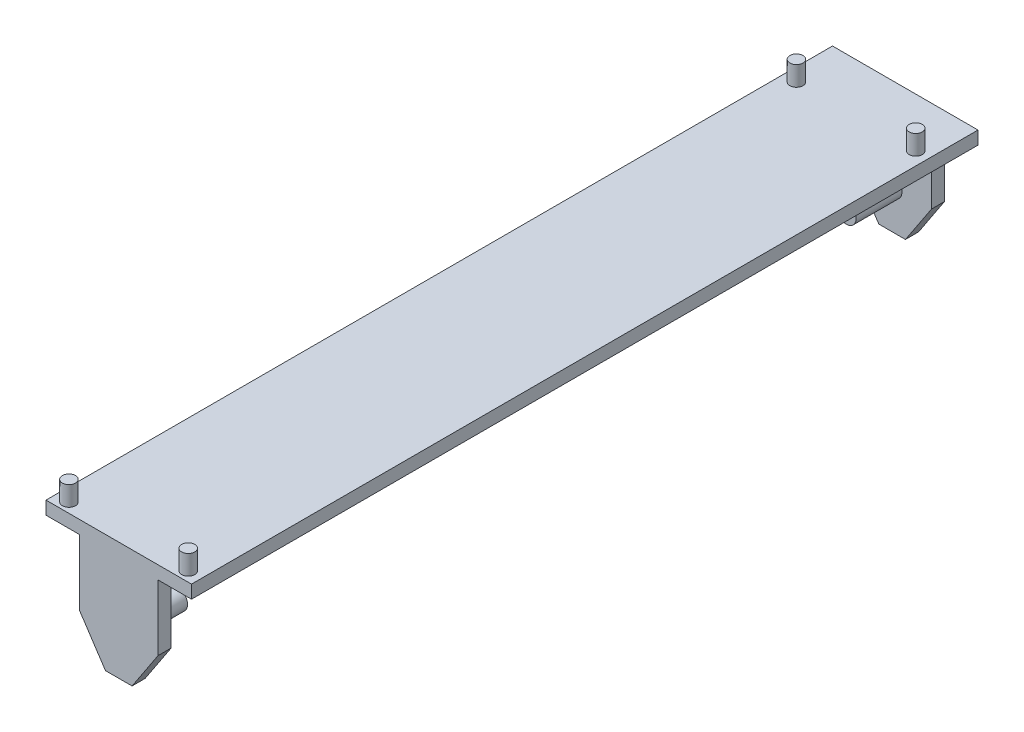
ISO-10303-21;
HEADER;
FILE_DESCRIPTION(('STEP AP214'),'2;1');
FILE_NAME('part.step','',(''),(''),'','','');
FILE_SCHEMA(('AUTOMOTIVE_DESIGN { 1 0 10303 214 1 1 1 1 }'));
ENDSEC;
DATA;
#1=APPLICATION_CONTEXT('core data for automotive mechanical design processes');
#2=APPLICATION_PROTOCOL_DEFINITION('international standard','automotive_design',2000,#1);
#3=PRODUCT_CONTEXT('',#1,'mechanical');
#4=PRODUCT('Part','Part','',(#3));
#5=PRODUCT_RELATED_PRODUCT_CATEGORY('part','',(#4));
#6=PRODUCT_DEFINITION_FORMATION('','',#4);
#7=PRODUCT_DEFINITION_CONTEXT('part definition',#1,'design');
#8=PRODUCT_DEFINITION('design','',#6,#7);
#9=PRODUCT_DEFINITION_SHAPE('','',#8);
#10=(LENGTH_UNIT() NAMED_UNIT(*) SI_UNIT(.MILLI.,.METRE.));
#11=(NAMED_UNIT(*) PLANE_ANGLE_UNIT() SI_UNIT($,.RADIAN.));
#12=(NAMED_UNIT(*) SI_UNIT($,.STERADIAN.) SOLID_ANGLE_UNIT());
#13=UNCERTAINTY_MEASURE_WITH_UNIT(LENGTH_MEASURE(1.E-05),#10,'distance_accuracy_value','');
#14=(GEOMETRIC_REPRESENTATION_CONTEXT(3) GLOBAL_UNCERTAINTY_ASSIGNED_CONTEXT((#13)) GLOBAL_UNIT_ASSIGNED_CONTEXT((#10,
#11,#12)) REPRESENTATION_CONTEXT('',''));
#15=CARTESIAN_POINT('',(0.,0.,0.));
#16=DIRECTION('',(0.,0.,1.));
#17=DIRECTION('',(1.,0.,0.));
#18=AXIS2_PLACEMENT_3D('',#15,#16,#17);
#19=CARTESIAN_POINT('',(-20.8608858903211,-13.8076071996793,10.));
#20=DIRECTION('',(0.833884202399052,0.551939432355849,0.));
#21=DIRECTION('',(-0.551939432355849,0.833884202399052,0.));
#22=AXIS2_PLACEMENT_3D('',#19,#20,#21);
#23=PLANE('',#22);
#24=DIRECTION('',(0.551939432355849,-0.833884202399052,0.));
#25=VECTOR('',#24,1.);
#26=CARTESIAN_POINT('',(-20.8608858903211,-13.8076071996793,0.));
#27=LINE('',#26,#25);
#28=CARTESIAN_POINT('',(-30.,0.,0.));
#29=VERTEX_POINT('',#28);
#30=CARTESIAN_POINT('',(-10.1433065609851,-30.,0.));
#31=VERTEX_POINT('',#30);
#32=EDGE_CURVE('E147',#29,#31,#27,.T.);
#33=ORIENTED_EDGE('',*,*,#32,.T.);
#34=DIRECTION('',(0.,0.,-1.));
#35=VECTOR('',#34,1.);
#36=CARTESIAN_POINT('',(-10.1433065609851,-30.,10.));
#37=LINE('',#36,#35);
#38=CARTESIAN_POINT('',(-10.1433065609851,-30.,10.));
#39=VERTEX_POINT('',#38);
#40=EDGE_CURVE('E11',#39,#31,#37,.T.);
#41=ORIENTED_EDGE('',*,*,#40,.F.);
#42=DIRECTION('',(0.551939432355849,-0.833884202399052,0.));
#43=VECTOR('',#42,1.);
#44=CARTESIAN_POINT('',(-20.8608858903211,-13.8076071996793,10.));
#45=LINE('',#44,#43);
#46=CARTESIAN_POINT('',(-30.,0.,10.));
#47=VERTEX_POINT('',#46);
#48=EDGE_CURVE('E150',#47,#39,#45,.T.);
#49=ORIENTED_EDGE('',*,*,#48,.F.);
#50=DIRECTION('',(0.,0.,-1.));
#51=VECTOR('',#50,1.);
#52=CARTESIAN_POINT('',(-30.,0.,10.));
#53=LINE('',#52,#51);
#54=EDGE_CURVE('E155',#47,#29,#53,.T.);
#55=ORIENTED_EDGE('',*,*,#54,.T.);
#56=EDGE_LOOP('',(#33,#41,#49,#55));
#57=FACE_BOUND('',#56,.T.);
#58=ADVANCED_FACE('F35',(#57),#23,.F.);
#59=CARTESIAN_POINT('',(0.,-30.,10.));
#60=DIRECTION('',(0.,1.,0.));
#61=DIRECTION('',(0.,0.,1.));
#62=AXIS2_PLACEMENT_3D('',#59,#60,#61);
#63=PLANE('',#62);
#64=DIRECTION('',(1.,0.,0.));
#65=VECTOR('',#64,1.);
#66=CARTESIAN_POINT('',(0.,-30.,0.));
#67=LINE('',#66,#65);
#68=CARTESIAN_POINT('',(10.1433065609851,-30.,0.));
#69=VERTEX_POINT('',#68);
#70=EDGE_CURVE('E158',#31,#69,#67,.T.);
#71=ORIENTED_EDGE('',*,*,#70,.T.);
#72=DIRECTION('',(0.,0.,-1.));
#73=VECTOR('',#72,1.);
#74=CARTESIAN_POINT('',(10.1433065609851,-30.,10.));
#75=LINE('',#74,#73);
#76=CARTESIAN_POINT('',(10.1433065609851,-30.,10.));
#77=VERTEX_POINT('',#76);
#78=EDGE_CURVE('E43',#77,#69,#75,.T.);
#79=ORIENTED_EDGE('',*,*,#78,.F.);
#80=DIRECTION('',(1.,0.,0.));
#81=VECTOR('',#80,1.);
#82=CARTESIAN_POINT('',(0.,-30.,10.));
#83=LINE('',#82,#81);
#84=EDGE_CURVE('E82',#39,#77,#83,.T.);
#85=ORIENTED_EDGE('',*,*,#84,.F.);
#86=ORIENTED_EDGE('',*,*,#40,.T.);
#87=EDGE_LOOP('',(#71,#79,#85,#86));
#88=FACE_BOUND('',#87,.T.);
#89=ADVANCED_FACE('F173',(#88),#63,.F.);
#90=CARTESIAN_POINT('',(20.8608858903211,-13.8076071996793,10.));
#91=DIRECTION('',(0.833884202399053,-0.551939432355848,0.));
#92=DIRECTION('',(0.551939432355848,0.833884202399053,0.));
#93=AXIS2_PLACEMENT_3D('',#90,#91,#92);
#94=PLANE('',#93);
#95=DIRECTION('',(-0.551939432355848,-0.833884202399053,0.));
#96=VECTOR('',#95,1.);
#97=CARTESIAN_POINT('',(20.8608858903211,-13.8076071996793,0.));
#98=LINE('',#97,#96);
#99=CARTESIAN_POINT('',(30.,0.,0.));
#100=VERTEX_POINT('',#99);
#101=EDGE_CURVE('E161',#100,#69,#98,.T.);
#102=ORIENTED_EDGE('',*,*,#101,.F.);
#103=DIRECTION('',(0.,0.,-1.));
#104=VECTOR('',#103,1.);
#105=CARTESIAN_POINT('',(30.,0.,10.));
#106=LINE('',#105,#104);
#107=CARTESIAN_POINT('',(30.,0.,10.));
#108=VERTEX_POINT('',#107);
#109=EDGE_CURVE('E113',#108,#100,#106,.T.);
#110=ORIENTED_EDGE('',*,*,#109,.F.);
#111=DIRECTION('',(-0.551939432355848,-0.833884202399053,0.));
#112=VECTOR('',#111,1.);
#113=CARTESIAN_POINT('',(20.8608858903211,-13.8076071996793,10.));
#114=LINE('',#113,#112);
#115=EDGE_CURVE('E102',#108,#77,#114,.T.);
#116=ORIENTED_EDGE('',*,*,#115,.T.);
#117=ORIENTED_EDGE('',*,*,#78,.T.);
#118=EDGE_LOOP('',(#102,#110,#116,#117));
#119=FACE_BOUND('',#118,.T.);
#120=ADVANCED_FACE('F172',(#119),#94,.T.);
#121=CARTESIAN_POINT('',(30.,0.,10.));
#122=DIRECTION('',(-1.,0.,0.));
#123=DIRECTION('',(0.,-1.,0.));
#124=AXIS2_PLACEMENT_3D('',#121,#122,#123);
#125=PLANE('',#124);
#126=DIRECTION('',(0.,1.,0.));
#127=VECTOR('',#126,1.);
#128=CARTESIAN_POINT('',(30.,0.,0.));
#129=LINE('',#128,#127);
#130=CARTESIAN_POINT('',(30.,50.,0.));
#131=VERTEX_POINT('',#130);
#132=EDGE_CURVE('E110',#100,#131,#129,.T.);
#133=ORIENTED_EDGE('',*,*,#132,.T.);
#134=DIRECTION('',(0.,0.,-1.));
#135=VECTOR('',#134,1.);
#136=CARTESIAN_POINT('',(30.,50.,10.));
#137=LINE('',#136,#135);
#138=CARTESIAN_POINT('',(30.,50.,10.));
#139=VERTEX_POINT('',#138);
#140=EDGE_CURVE('E107',#139,#131,#137,.T.);
#141=ORIENTED_EDGE('',*,*,#140,.F.);
#142=DIRECTION('',(0.,1.,0.));
#143=VECTOR('',#142,1.);
#144=CARTESIAN_POINT('',(30.,0.,10.));
#145=LINE('',#144,#143);
#146=EDGE_CURVE('E93',#108,#139,#145,.T.);
#147=ORIENTED_EDGE('',*,*,#146,.F.);
#148=ORIENTED_EDGE('',*,*,#109,.T.);
#149=EDGE_LOOP('',(#133,#141,#147,#148));
#150=FACE_BOUND('',#149,.T.);
#151=ADVANCED_FACE('F108',(#150),#125,.F.);
#152=CARTESIAN_POINT('',(-30.,0.,10.));
#153=DIRECTION('',(1.,0.,0.));
#154=DIRECTION('',(0.,1.,0.));
#155=AXIS2_PLACEMENT_3D('',#152,#153,#154);
#156=PLANE('',#155);
#157=DIRECTION('',(0.,-1.,0.));
#158=VECTOR('',#157,1.);
#159=CARTESIAN_POINT('',(-30.,0.,0.));
#160=LINE('',#159,#158);
#161=CARTESIAN_POINT('',(-30.,50.,0.));
#162=VERTEX_POINT('',#161);
#163=EDGE_CURVE('E74',#162,#29,#160,.T.);
#164=ORIENTED_EDGE('',*,*,#163,.T.);
#165=ORIENTED_EDGE('',*,*,#54,.F.);
#166=DIRECTION('',(0.,-1.,0.));
#167=VECTOR('',#166,1.);
#168=CARTESIAN_POINT('',(-30.,0.,10.));
#169=LINE('',#168,#167);
#170=CARTESIAN_POINT('',(-30.,50.,10.));
#171=VERTEX_POINT('',#170);
#172=EDGE_CURVE('E51',#171,#47,#169,.T.);
#173=ORIENTED_EDGE('',*,*,#172,.F.);
#174=DIRECTION('',(0.,0.,-1.));
#175=VECTOR('',#174,1.);
#176=CARTESIAN_POINT('',(-30.,50.,10.));
#177=LINE('',#176,#175);
#178=EDGE_CURVE('E71',#171,#162,#177,.T.);
#179=ORIENTED_EDGE('',*,*,#178,.T.);
#180=EDGE_LOOP('',(#164,#165,#173,#179));
#181=FACE_BOUND('',#180,.T.);
#182=ADVANCED_FACE('F353',(#181),#156,.F.);
#183=CARTESIAN_POINT('',(0.,0.,10.));
#184=DIRECTION('',(0.,0.,1.));
#185=DIRECTION('',(1.,0.,0.));
#186=AXIS2_PLACEMENT_3D('',#183,#184,#185);
#187=PLANE('',#186);
#188=ORIENTED_EDGE('',*,*,#48,.T.);
#189=ORIENTED_EDGE('',*,*,#84,.T.);
#190=ORIENTED_EDGE('',*,*,#115,.F.);
#191=ORIENTED_EDGE('',*,*,#146,.T.);
#192=DIRECTION('',(1.,0.,0.));
#193=VECTOR('',#192,1.);
#194=CARTESIAN_POINT('',(-55.5,50.,10.));
#195=LINE('',#194,#193);
#196=CARTESIAN_POINT('',(55.5,50.,10.));
#197=VERTEX_POINT('',#196);
#198=EDGE_CURVE('E99',#139,#197,#195,.T.);
#199=ORIENTED_EDGE('',*,*,#198,.T.);
#200=DIRECTION('',(0.,1.,0.));
#201=VECTOR('',#200,1.);
#202=CARTESIAN_POINT('',(55.5,50.,10.));
#203=LINE('',#202,#201);
#204=CARTESIAN_POINT('',(55.5,60.,10.));
#205=VERTEX_POINT('',#204);
#206=EDGE_CURVE('E123',#197,#205,#203,.T.);
#207=ORIENTED_EDGE('',*,*,#206,.T.);
#208=DIRECTION('',(-1.,0.,0.));
#209=VECTOR('',#208,1.);
#210=CARTESIAN_POINT('',(-55.5,60.,10.));
#211=LINE('',#210,#209);
#212=CARTESIAN_POINT('',(-55.5,60.,10.));
#213=VERTEX_POINT('',#212);
#214=EDGE_CURVE('E130',#205,#213,#211,.T.);
#215=ORIENTED_EDGE('',*,*,#214,.T.);
#216=DIRECTION('',(0.,-1.,0.));
#217=VECTOR('',#216,1.);
#218=CARTESIAN_POINT('',(-55.5,50.,10.));
#219=LINE('',#218,#217);
#220=CARTESIAN_POINT('',(-55.5,50.,10.));
#221=VERTEX_POINT('',#220);
#222=EDGE_CURVE('E121',#213,#221,#219,.T.);
#223=ORIENTED_EDGE('',*,*,#222,.T.);
#224=EDGE_CURVE('E120',#221,#171,#195,.T.);
#225=ORIENTED_EDGE('',*,*,#224,.T.);
#226=ORIENTED_EDGE('',*,*,#172,.T.);
#227=EDGE_LOOP('',(#188,#189,#190,#191,#199,#207,#215,#223,#225,#226));
#228=FACE_BOUND('',#227,.T.);
#229=ADVANCED_FACE('F95',(#228),#187,.T.);
#230=CARTESIAN_POINT('',(0.,0.,0.));
#231=DIRECTION('',(0.,0.,1.));
#232=DIRECTION('',(1.,0.,0.));
#233=AXIS2_PLACEMENT_3D('',#230,#231,#232);
#234=PLANE('',#233);
#235=CARTESIAN_POINT('',(0.,0.,0.));
#236=DIRECTION('',(0.,0.,1.));
#237=DIRECTION('',(1.,0.,0.));
#238=AXIS2_PLACEMENT_3D('',#235,#236,#237);
#239=CIRCLE('',#238,7.5);
#240=CARTESIAN_POINT('',(7.5,0.,0.));
#241=VERTEX_POINT('',#240);
#242=EDGE_CURVE('E137',#241,#241,#239,.T.);
#243=ORIENTED_EDGE('',*,*,#242,.T.);
#244=EDGE_LOOP('',(#243));
#245=FACE_BOUND('',#244,.T.);
#246=ORIENTED_EDGE('',*,*,#32,.F.);
#247=ORIENTED_EDGE('',*,*,#163,.F.);
#248=DIRECTION('',(-1.,0.,0.));
#249=VECTOR('',#248,1.);
#250=CARTESIAN_POINT('',(0.,50.,0.));
#251=LINE('',#250,#249);
#252=EDGE_CURVE('E165',#131,#162,#251,.T.);
#253=ORIENTED_EDGE('',*,*,#252,.F.);
#254=ORIENTED_EDGE('',*,*,#132,.F.);
#255=ORIENTED_EDGE('',*,*,#101,.T.);
#256=ORIENTED_EDGE('',*,*,#70,.F.);
#257=EDGE_LOOP('',(#246,#247,#253,#254,#255,#256));
#258=FACE_BOUND('',#257,.T.);
#259=ADVANCED_FACE('F177',(#245,#258),#234,.F.);
#260=CARTESIAN_POINT('',(0.,0.,-35.));
#261=DIRECTION('',(0.,0.,1.));
#262=DIRECTION('',(1.,0.,0.));
#263=AXIS2_PLACEMENT_3D('',#260,#261,#262);
#264=CYLINDRICAL_SURFACE('',#263,7.5);
#265=CARTESIAN_POINT('',(0.,0.,-35.));
#266=DIRECTION('',(0.,0.,1.));
#267=DIRECTION('',(1.,0.,0.));
#268=AXIS2_PLACEMENT_3D('',#265,#266,#267);
#269=CIRCLE('',#268,7.5);
#270=CARTESIAN_POINT('',(7.5,0.,-35.));
#271=VERTEX_POINT('',#270);
#272=EDGE_CURVE('E144',#271,#271,#269,.T.);
#273=ORIENTED_EDGE('',*,*,#272,.T.);
#274=EDGE_LOOP('',(#273));
#275=FACE_BOUND('',#274,.T.);
#276=ORIENTED_EDGE('',*,*,#242,.F.);
#277=EDGE_LOOP('',(#276));
#278=FACE_BOUND('',#277,.T.);
#279=ADVANCED_FACE('F400',(#275,#278),#264,.T.);
#280=CARTESIAN_POINT('',(0.,0.,-35.));
#281=DIRECTION('',(0.,0.,1.));
#282=DIRECTION('',(1.,0.,0.));
#283=AXIS2_PLACEMENT_3D('',#280,#281,#282);
#284=PLANE('',#283);
#285=ORIENTED_EDGE('',*,*,#272,.F.);
#286=EDGE_LOOP('',(#285));
#287=FACE_BOUND('',#286,.T.);
#288=ADVANCED_FACE('F380',(#287),#284,.F.);
#289=CARTESIAN_POINT('',(-55.5,50.,-290.));
#290=DIRECTION('',(0.,-1.,0.));
#291=DIRECTION('',(0.,0.,-1.));
#292=AXIS2_PLACEMENT_3D('',#289,#290,#291);
#293=PLANE('',#292);
#294=ORIENTED_EDGE('',*,*,#178,.F.);
#295=ORIENTED_EDGE('',*,*,#224,.F.);
#296=DIRECTION('',(0.,0.,1.));
#297=VECTOR('',#296,1.);
#298=CARTESIAN_POINT('',(-55.5,50.,-290.));
#299=LINE('',#298,#297);
#300=CARTESIAN_POINT('',(-55.5,50.,-590.));
#301=VERTEX_POINT('',#300);
#302=EDGE_CURVE('E133',#301,#221,#299,.T.);
#303=ORIENTED_EDGE('',*,*,#302,.F.);
#304=DIRECTION('',(1.,0.,0.));
#305=VECTOR('',#304,1.);
#306=CARTESIAN_POINT('',(-55.5,50.,-590.));
#307=LINE('',#306,#305);
#308=CARTESIAN_POINT('',(-30.,50.,-590.));
#309=VERTEX_POINT('',#308);
#310=EDGE_CURVE('E242',#301,#309,#307,.T.);
#311=ORIENTED_EDGE('',*,*,#310,.T.);
#312=DIRECTION('',(0.,0.,1.));
#313=VECTOR('',#312,1.);
#314=CARTESIAN_POINT('',(-30.,50.,-590.));
#315=LINE('',#314,#313);
#316=CARTESIAN_POINT('',(-30.,50.,-580.));
#317=VERTEX_POINT('',#316);
#318=EDGE_CURVE('E299',#309,#317,#315,.T.);
#319=ORIENTED_EDGE('',*,*,#318,.T.);
#320=DIRECTION('',(-1.,0.,0.));
#321=VECTOR('',#320,1.);
#322=CARTESIAN_POINT('',(0.,50.,-580.));
#323=LINE('',#322,#321);
#324=CARTESIAN_POINT('',(30.,50.,-580.));
#325=VERTEX_POINT('',#324);
#326=EDGE_CURVE('E294',#325,#317,#323,.T.);
#327=ORIENTED_EDGE('',*,*,#326,.F.);
#328=DIRECTION('',(0.,0.,1.));
#329=VECTOR('',#328,1.);
#330=CARTESIAN_POINT('',(30.,50.,-590.));
#331=LINE('',#330,#329);
#332=CARTESIAN_POINT('',(30.,50.,-590.));
#333=VERTEX_POINT('',#332);
#334=EDGE_CURVE('E301',#333,#325,#331,.T.);
#335=ORIENTED_EDGE('',*,*,#334,.F.);
#336=CARTESIAN_POINT('',(55.5,50.,-590.));
#337=VERTEX_POINT('',#336);
#338=EDGE_CURVE('E248',#333,#337,#307,.T.);
#339=ORIENTED_EDGE('',*,*,#338,.T.);
#340=DIRECTION('',(0.,0.,1.));
#341=VECTOR('',#340,1.);
#342=CARTESIAN_POINT('',(55.5,50.,-290.));
#343=LINE('',#342,#341);
#344=EDGE_CURVE('E118',#337,#197,#343,.T.);
#345=ORIENTED_EDGE('',*,*,#344,.T.);
#346=ORIENTED_EDGE('',*,*,#198,.F.);
#347=ORIENTED_EDGE('',*,*,#140,.T.);
#348=ORIENTED_EDGE('',*,*,#252,.T.);
#349=EDGE_LOOP('',(#294,#295,#303,#311,#319,#327,#335,#339,#345,#346,#347,#348));
#350=FACE_BOUND('',#349,.T.);
#351=ADVANCED_FACE('F115',(#350),#293,.T.);
#352=CARTESIAN_POINT('',(-55.5,50.,-290.));
#353=DIRECTION('',(-1.,0.,0.));
#354=DIRECTION('',(0.,0.,1.));
#355=AXIS2_PLACEMENT_3D('',#352,#353,#354);
#356=PLANE('',#355);
#357=ORIENTED_EDGE('',*,*,#222,.F.);
#358=DIRECTION('',(0.,0.,1.));
#359=VECTOR('',#358,1.);
#360=CARTESIAN_POINT('',(-55.5,60.,-290.));
#361=LINE('',#360,#359);
#362=CARTESIAN_POINT('',(-55.5,60.,-590.));
#363=VERTEX_POINT('',#362);
#364=EDGE_CURVE('E134',#363,#213,#361,.T.);
#365=ORIENTED_EDGE('',*,*,#364,.F.);
#366=DIRECTION('',(0.,-1.,0.));
#367=VECTOR('',#366,1.);
#368=CARTESIAN_POINT('',(-55.5,50.,-590.));
#369=LINE('',#368,#367);
#370=EDGE_CURVE('E245',#363,#301,#369,.T.);
#371=ORIENTED_EDGE('',*,*,#370,.T.);
#372=ORIENTED_EDGE('',*,*,#302,.T.);
#373=EDGE_LOOP('',(#357,#365,#371,#372));
#374=FACE_BOUND('',#373,.T.);
#375=ADVANCED_FACE('F189',(#374),#356,.T.);
#376=CARTESIAN_POINT('',(-55.5,60.,-290.));
#377=DIRECTION('',(0.,1.,0.));
#378=DIRECTION('',(-1.,0.,0.));
#379=AXIS2_PLACEMENT_3D('',#376,#377,#378);
#380=PLANE('',#379);
#381=CARTESIAN_POINT('',(45.5,60.,-552.5));
#382=DIRECTION('',(0.,1.,0.));
#383=DIRECTION('',(-1.,0.,0.));
#384=AXIS2_PLACEMENT_3D('',#381,#382,#383);
#385=CIRCLE('',#384,5.);
#386=CARTESIAN_POINT('',(40.5,60.,-552.5));
#387=VERTEX_POINT('',#386);
#388=EDGE_CURVE('E590',#387,#387,#385,.T.);
#389=ORIENTED_EDGE('',*,*,#388,.F.);
#390=EDGE_LOOP('',(#389));
#391=FACE_BOUND('',#390,.T.);
#392=CARTESIAN_POINT('',(-45.5,60.,-552.5));
#393=DIRECTION('',(0.,1.,0.));
#394=DIRECTION('',(-1.,0.,0.));
#395=AXIS2_PLACEMENT_3D('',#392,#393,#394);
#396=CIRCLE('',#395,5.);
#397=CARTESIAN_POINT('',(-50.5,60.,-552.5));
#398=VERTEX_POINT('',#397);
#399=EDGE_CURVE('E589',#398,#398,#396,.T.);
#400=ORIENTED_EDGE('',*,*,#399,.F.);
#401=EDGE_LOOP('',(#400));
#402=FACE_BOUND('',#401,.T.);
#403=CARTESIAN_POINT('',(45.5,60.,2.5));
#404=DIRECTION('',(0.,1.,0.));
#405=DIRECTION('',(-1.,0.,0.));
#406=AXIS2_PLACEMENT_3D('',#403,#404,#405);
#407=CIRCLE('',#406,5.);
#408=CARTESIAN_POINT('',(40.5,60.,2.5));
#409=VERTEX_POINT('',#408);
#410=EDGE_CURVE('E599',#409,#409,#407,.T.);
#411=ORIENTED_EDGE('',*,*,#410,.F.);
#412=EDGE_LOOP('',(#411));
#413=FACE_BOUND('',#412,.T.);
#414=CARTESIAN_POINT('',(-45.5,60.,2.49999999999995));
#415=DIRECTION('',(0.,1.,0.));
#416=DIRECTION('',(-1.,0.,0.));
#417=AXIS2_PLACEMENT_3D('',#414,#415,#416);
#418=CIRCLE('',#417,5.);
#419=CARTESIAN_POINT('',(-50.5,60.,2.49999999999995));
#420=VERTEX_POINT('',#419);
#421=EDGE_CURVE('E604',#420,#420,#418,.T.);
#422=ORIENTED_EDGE('',*,*,#421,.F.);
#423=EDGE_LOOP('',(#422));
#424=FACE_BOUND('',#423,.T.);
#425=ORIENTED_EDGE('',*,*,#214,.F.);
#426=DIRECTION('',(0.,0.,1.));
#427=VECTOR('',#426,1.);
#428=CARTESIAN_POINT('',(55.5,60.,-290.));
#429=LINE('',#428,#427);
#430=CARTESIAN_POINT('',(55.5,60.,-590.));
#431=VERTEX_POINT('',#430);
#432=EDGE_CURVE('E138',#431,#205,#429,.T.);
#433=ORIENTED_EDGE('',*,*,#432,.F.);
#434=DIRECTION('',(-1.,0.,0.));
#435=VECTOR('',#434,1.);
#436=CARTESIAN_POINT('',(-55.5,60.,-590.));
#437=LINE('',#436,#435);
#438=EDGE_CURVE('E258',#431,#363,#437,.T.);
#439=ORIENTED_EDGE('',*,*,#438,.T.);
#440=ORIENTED_EDGE('',*,*,#364,.T.);
#441=EDGE_LOOP('',(#425,#433,#439,#440));
#442=FACE_BOUND('',#441,.T.);
#443=ADVANCED_FACE('F334',(#391,#402,#413,#424,#442),#380,.T.);
#444=CARTESIAN_POINT('',(55.5,50.,-290.));
#445=DIRECTION('',(1.,0.,0.));
#446=DIRECTION('',(0.,0.,-1.));
#447=AXIS2_PLACEMENT_3D('',#444,#445,#446);
#448=PLANE('',#447);
#449=ORIENTED_EDGE('',*,*,#206,.F.);
#450=ORIENTED_EDGE('',*,*,#344,.F.);
#451=DIRECTION('',(0.,1.,0.));
#452=VECTOR('',#451,1.);
#453=CARTESIAN_POINT('',(55.5,50.,-590.));
#454=LINE('',#453,#452);
#455=EDGE_CURVE('E255',#337,#431,#454,.T.);
#456=ORIENTED_EDGE('',*,*,#455,.T.);
#457=ORIENTED_EDGE('',*,*,#432,.T.);
#458=EDGE_LOOP('',(#449,#450,#456,#457));
#459=FACE_BOUND('',#458,.T.);
#460=ADVANCED_FACE('F333',(#459),#448,.T.);
#461=CARTESIAN_POINT('',(-20.8608858903211,-13.8076071996793,-590.));
#462=DIRECTION('',(0.833884202399052,0.551939432355849,0.));
#463=DIRECTION('',(-0.551939432355849,0.833884202399052,0.));
#464=AXIS2_PLACEMENT_3D('',#461,#462,#463);
#465=PLANE('',#464);
#466=DIRECTION('',(0.551939432355849,-0.833884202399052,0.));
#467=VECTOR('',#466,1.);
#468=CARTESIAN_POINT('',(-20.8608858903211,-13.8076071996793,-580.));
#469=LINE('',#468,#467);
#470=CARTESIAN_POINT('',(-30.,0.,-580.));
#471=VERTEX_POINT('',#470);
#472=CARTESIAN_POINT('',(-10.1433065609851,-30.,-580.));
#473=VERTEX_POINT('',#472);
#474=EDGE_CURVE('E267',#471,#473,#469,.T.);
#475=ORIENTED_EDGE('',*,*,#474,.F.);
#476=DIRECTION('',(0.,0.,1.));
#477=VECTOR('',#476,1.);
#478=CARTESIAN_POINT('',(-30.,0.,-590.));
#479=LINE('',#478,#477);
#480=CARTESIAN_POINT('',(-30.,0.,-590.));
#481=VERTEX_POINT('',#480);
#482=EDGE_CURVE('E283',#481,#471,#479,.T.);
#483=ORIENTED_EDGE('',*,*,#482,.F.);
#484=DIRECTION('',(0.551939432355849,-0.833884202399052,0.));
#485=VECTOR('',#484,1.);
#486=CARTESIAN_POINT('',(-20.8608858903211,-13.8076071996793,-590.));
#487=LINE('',#486,#485);
#488=CARTESIAN_POINT('',(-10.1433065609851,-30.,-590.));
#489=VERTEX_POINT('',#488);
#490=EDGE_CURVE('E270',#481,#489,#487,.T.);
#491=ORIENTED_EDGE('',*,*,#490,.T.);
#492=DIRECTION('',(0.,0.,1.));
#493=VECTOR('',#492,1.);
#494=CARTESIAN_POINT('',(-10.1433065609851,-30.,-590.));
#495=LINE('',#494,#493);
#496=EDGE_CURVE('E125',#489,#473,#495,.T.);
#497=ORIENTED_EDGE('',*,*,#496,.T.);
#498=EDGE_LOOP('',(#475,#483,#491,#497));
#499=FACE_BOUND('',#498,.T.);
#500=ADVANCED_FACE('F313',(#499),#465,.F.);
#501=CARTESIAN_POINT('',(0.,-30.,-590.));
#502=DIRECTION('',(0.,1.,0.));
#503=DIRECTION('',(0.,0.,-1.));
#504=AXIS2_PLACEMENT_3D('',#501,#502,#503);
#505=PLANE('',#504);
#506=DIRECTION('',(1.,0.,0.));
#507=VECTOR('',#506,1.);
#508=CARTESIAN_POINT('',(0.,-30.,-580.));
#509=LINE('',#508,#507);
#510=CARTESIAN_POINT('',(10.1433065609851,-30.,-580.));
#511=VERTEX_POINT('',#510);
#512=EDGE_CURVE('E286',#473,#511,#509,.T.);
#513=ORIENTED_EDGE('',*,*,#512,.F.);
#514=ORIENTED_EDGE('',*,*,#496,.F.);
#515=DIRECTION('',(1.,0.,0.));
#516=VECTOR('',#515,1.);
#517=CARTESIAN_POINT('',(0.,-30.,-590.));
#518=LINE('',#517,#516);
#519=CARTESIAN_POINT('',(10.1433065609851,-30.,-590.));
#520=VERTEX_POINT('',#519);
#521=EDGE_CURVE('E273',#489,#520,#518,.T.);
#522=ORIENTED_EDGE('',*,*,#521,.T.);
#523=DIRECTION('',(0.,0.,1.));
#524=VECTOR('',#523,1.);
#525=CARTESIAN_POINT('',(10.1433065609851,-30.,-590.));
#526=LINE('',#525,#524);
#527=EDGE_CURVE('E307',#520,#511,#526,.T.);
#528=ORIENTED_EDGE('',*,*,#527,.T.);
#529=EDGE_LOOP('',(#513,#514,#522,#528));
#530=FACE_BOUND('',#529,.T.);
#531=ADVANCED_FACE('F324',(#530),#505,.F.);
#532=CARTESIAN_POINT('',(20.8608858903211,-13.8076071996793,-590.));
#533=DIRECTION('',(0.833884202399053,-0.551939432355848,0.));
#534=DIRECTION('',(0.551939432355848,0.833884202399053,0.));
#535=AXIS2_PLACEMENT_3D('',#532,#533,#534);
#536=PLANE('',#535);
#537=DIRECTION('',(-0.551939432355848,-0.833884202399053,0.));
#538=VECTOR('',#537,1.);
#539=CARTESIAN_POINT('',(20.8608858903211,-13.8076071996793,-580.));
#540=LINE('',#539,#538);
#541=CARTESIAN_POINT('',(30.,0.,-580.));
#542=VERTEX_POINT('',#541);
#543=EDGE_CURVE('E289',#542,#511,#540,.T.);
#544=ORIENTED_EDGE('',*,*,#543,.T.);
#545=ORIENTED_EDGE('',*,*,#527,.F.);
#546=DIRECTION('',(-0.551939432355848,-0.833884202399053,0.));
#547=VECTOR('',#546,1.);
#548=CARTESIAN_POINT('',(20.8608858903211,-13.8076071996793,-590.));
#549=LINE('',#548,#547);
#550=CARTESIAN_POINT('',(30.,0.,-590.));
#551=VERTEX_POINT('',#550);
#552=EDGE_CURVE('E277',#551,#520,#549,.T.);
#553=ORIENTED_EDGE('',*,*,#552,.F.);
#554=DIRECTION('',(0.,0.,1.));
#555=VECTOR('',#554,1.);
#556=CARTESIAN_POINT('',(30.,0.,-590.));
#557=LINE('',#556,#555);
#558=EDGE_CURVE('E304',#551,#542,#557,.T.);
#559=ORIENTED_EDGE('',*,*,#558,.T.);
#560=EDGE_LOOP('',(#544,#545,#553,#559));
#561=FACE_BOUND('',#560,.T.);
#562=ADVANCED_FACE('F326',(#561),#536,.T.);
#563=CARTESIAN_POINT('',(30.,0.,-590.));
#564=DIRECTION('',(-1.,0.,0.));
#565=DIRECTION('',(0.,-1.,0.));
#566=AXIS2_PLACEMENT_3D('',#563,#564,#565);
#567=PLANE('',#566);
#568=DIRECTION('',(0.,1.,0.));
#569=VECTOR('',#568,1.);
#570=CARTESIAN_POINT('',(30.,0.,-580.));
#571=LINE('',#570,#569);
#572=EDGE_CURVE('E291',#542,#325,#571,.T.);
#573=ORIENTED_EDGE('',*,*,#572,.F.);
#574=ORIENTED_EDGE('',*,*,#558,.F.);
#575=DIRECTION('',(0.,1.,0.));
#576=VECTOR('',#575,1.);
#577=CARTESIAN_POINT('',(30.,0.,-590.));
#578=LINE('',#577,#576);
#579=EDGE_CURVE('E279',#551,#333,#578,.T.);
#580=ORIENTED_EDGE('',*,*,#579,.T.);
#581=ORIENTED_EDGE('',*,*,#334,.T.);
#582=EDGE_LOOP('',(#573,#574,#580,#581));
#583=FACE_BOUND('',#582,.T.);
#584=ADVANCED_FACE('F329',(#583),#567,.F.);
#585=CARTESIAN_POINT('',(-30.,0.,-590.));
#586=DIRECTION('',(1.,0.,0.));
#587=DIRECTION('',(0.,1.,0.));
#588=AXIS2_PLACEMENT_3D('',#585,#586,#587);
#589=PLANE('',#588);
#590=DIRECTION('',(0.,-1.,0.));
#591=VECTOR('',#590,1.);
#592=CARTESIAN_POINT('',(-30.,0.,-580.));
#593=LINE('',#592,#591);
#594=EDGE_CURVE('E274',#317,#471,#593,.T.);
#595=ORIENTED_EDGE('',*,*,#594,.F.);
#596=ORIENTED_EDGE('',*,*,#318,.F.);
#597=DIRECTION('',(0.,-1.,0.));
#598=VECTOR('',#597,1.);
#599=CARTESIAN_POINT('',(-30.,0.,-590.));
#600=LINE('',#599,#598);
#601=EDGE_CURVE('E253',#309,#481,#600,.T.);
#602=ORIENTED_EDGE('',*,*,#601,.T.);
#603=ORIENTED_EDGE('',*,*,#482,.T.);
#604=EDGE_LOOP('',(#595,#596,#602,#603));
#605=FACE_BOUND('',#604,.T.);
#606=ADVANCED_FACE('F321',(#605),#589,.F.);
#607=CARTESIAN_POINT('',(0.,0.,-590.));
#608=DIRECTION('',(0.,0.,-1.));
#609=DIRECTION('',(1.,0.,0.));
#610=AXIS2_PLACEMENT_3D('',#607,#608,#609);
#611=PLANE('',#610);
#612=ORIENTED_EDGE('',*,*,#490,.F.);
#613=ORIENTED_EDGE('',*,*,#601,.F.);
#614=ORIENTED_EDGE('',*,*,#310,.F.);
#615=ORIENTED_EDGE('',*,*,#370,.F.);
#616=ORIENTED_EDGE('',*,*,#438,.F.);
#617=ORIENTED_EDGE('',*,*,#455,.F.);
#618=ORIENTED_EDGE('',*,*,#338,.F.);
#619=ORIENTED_EDGE('',*,*,#579,.F.);
#620=ORIENTED_EDGE('',*,*,#552,.T.);
#621=ORIENTED_EDGE('',*,*,#521,.F.);
#622=EDGE_LOOP('',(#612,#613,#614,#615,#616,#617,#618,#619,#620,#621));
#623=FACE_BOUND('',#622,.T.);
#624=ADVANCED_FACE('F252',(#623),#611,.T.);
#625=CARTESIAN_POINT('',(0.,0.,-580.));
#626=DIRECTION('',(0.,0.,-1.));
#627=DIRECTION('',(1.,0.,0.));
#628=AXIS2_PLACEMENT_3D('',#625,#626,#627);
#629=PLANE('',#628);
#630=CARTESIAN_POINT('',(0.,0.,-580.));
#631=DIRECTION('',(0.,0.,1.));
#632=DIRECTION('',(1.,0.,0.));
#633=AXIS2_PLACEMENT_3D('',#630,#631,#632);
#634=CIRCLE('',#633,7.5);
#635=CARTESIAN_POINT('',(7.5,0.,-580.));
#636=VERTEX_POINT('',#635);
#637=EDGE_CURVE('E263',#636,#636,#634,.T.);
#638=ORIENTED_EDGE('',*,*,#637,.F.);
#639=EDGE_LOOP('',(#638));
#640=FACE_BOUND('',#639,.T.);
#641=ORIENTED_EDGE('',*,*,#474,.T.);
#642=ORIENTED_EDGE('',*,*,#512,.T.);
#643=ORIENTED_EDGE('',*,*,#543,.F.);
#644=ORIENTED_EDGE('',*,*,#572,.T.);
#645=ORIENTED_EDGE('',*,*,#326,.T.);
#646=ORIENTED_EDGE('',*,*,#594,.T.);
#647=EDGE_LOOP('',(#641,#642,#643,#644,#645,#646));
#648=FACE_BOUND('',#647,.T.);
#649=ADVANCED_FACE('F317',(#640,#648),#629,.F.);
#650=CARTESIAN_POINT('',(0.,0.,-545.));
#651=DIRECTION('',(0.,0.,-1.));
#652=DIRECTION('',(1.,0.,0.));
#653=AXIS2_PLACEMENT_3D('',#650,#651,#652);
#654=CYLINDRICAL_SURFACE('',#653,7.5);
#655=CARTESIAN_POINT('',(0.,0.,-545.));
#656=DIRECTION('',(0.,0.,1.));
#657=DIRECTION('',(1.,0.,0.));
#658=AXIS2_PLACEMENT_3D('',#655,#656,#657);
#659=CIRCLE('',#658,7.5);
#660=CARTESIAN_POINT('',(7.5,0.,-545.));
#661=VERTEX_POINT('',#660);
#662=EDGE_CURVE('E264',#661,#661,#659,.T.);
#663=ORIENTED_EDGE('',*,*,#662,.F.);
#664=EDGE_LOOP('',(#663));
#665=FACE_BOUND('',#664,.T.);
#666=ORIENTED_EDGE('',*,*,#637,.T.);
#667=EDGE_LOOP('',(#666));
#668=FACE_BOUND('',#667,.T.);
#669=ADVANCED_FACE('F479',(#665,#668),#654,.T.);
#670=CARTESIAN_POINT('',(0.,0.,-545.));
#671=DIRECTION('',(0.,0.,-1.));
#672=DIRECTION('',(1.,0.,0.));
#673=AXIS2_PLACEMENT_3D('',#670,#671,#672);
#674=PLANE('',#673);
#675=ORIENTED_EDGE('',*,*,#662,.T.);
#676=EDGE_LOOP('',(#675));
#677=FACE_BOUND('',#676,.T.);
#678=ADVANCED_FACE('F489',(#677),#674,.F.);
#679=CARTESIAN_POINT('',(-45.5,75.,2.49999999999995));
#680=DIRECTION('',(0.,-1.,0.));
#681=DIRECTION('',(1.,0.,0.));
#682=AXIS2_PLACEMENT_3D('',#679,#680,#681);
#683=CYLINDRICAL_SURFACE('',#682,5.);
#684=CARTESIAN_POINT('',(-45.5,75.,2.49999999999995));
#685=DIRECTION('',(0.,1.,0.));
#686=DIRECTION('',(-1.,0.,0.));
#687=AXIS2_PLACEMENT_3D('',#684,#685,#686);
#688=CIRCLE('',#687,5.);
#689=CARTESIAN_POINT('',(-50.5,75.,2.49999999999995));
#690=VERTEX_POINT('',#689);
#691=EDGE_CURVE('E249',#690,#690,#688,.T.);
#692=ORIENTED_EDGE('',*,*,#691,.F.);
#693=EDGE_LOOP('',(#692));
#694=FACE_BOUND('',#693,.T.);
#695=ORIENTED_EDGE('',*,*,#421,.T.);
#696=EDGE_LOOP('',(#695));
#697=FACE_BOUND('',#696,.T.);
#698=ADVANCED_FACE('F498',(#694,#697),#683,.T.);
#699=CARTESIAN_POINT('',(-45.5,75.,2.49999999999995));
#700=DIRECTION('',(0.,1.,0.));
#701=DIRECTION('',(-1.,0.,0.));
#702=AXIS2_PLACEMENT_3D('',#699,#700,#701);
#703=PLANE('',#702);
#704=ORIENTED_EDGE('',*,*,#691,.T.);
#705=EDGE_LOOP('',(#704));
#706=FACE_BOUND('',#705,.T.);
#707=ADVANCED_FACE('F512',(#706),#703,.T.);
#708=CARTESIAN_POINT('',(45.5,75.,2.5));
#709=DIRECTION('',(0.,-1.,0.));
#710=DIRECTION('',(1.,0.,0.));
#711=AXIS2_PLACEMENT_3D('',#708,#709,#710);
#712=CYLINDRICAL_SURFACE('',#711,5.);
#713=CARTESIAN_POINT('',(45.5,75.,2.5));
#714=DIRECTION('',(0.,1.,0.));
#715=DIRECTION('',(-1.,0.,0.));
#716=AXIS2_PLACEMENT_3D('',#713,#714,#715);
#717=CIRCLE('',#716,5.);
#718=CARTESIAN_POINT('',(40.5,75.,2.5));
#719=VERTEX_POINT('',#718);
#720=EDGE_CURVE('E601',#719,#719,#717,.T.);
#721=ORIENTED_EDGE('',*,*,#720,.F.);
#722=EDGE_LOOP('',(#721));
#723=FACE_BOUND('',#722,.T.);
#724=ORIENTED_EDGE('',*,*,#410,.T.);
#725=EDGE_LOOP('',(#724));
#726=FACE_BOUND('',#725,.T.);
#727=ADVANCED_FACE('F522',(#723,#726),#712,.T.);
#728=CARTESIAN_POINT('',(45.5,75.,2.5));
#729=DIRECTION('',(0.,1.,0.));
#730=DIRECTION('',(-1.,0.,0.));
#731=AXIS2_PLACEMENT_3D('',#728,#729,#730);
#732=PLANE('',#731);
#733=ORIENTED_EDGE('',*,*,#720,.T.);
#734=EDGE_LOOP('',(#733));
#735=FACE_BOUND('',#734,.T.);
#736=ADVANCED_FACE('F532',(#735),#732,.T.);
#737=CARTESIAN_POINT('',(-45.5,75.,-552.5));
#738=DIRECTION('',(0.,-1.,0.));
#739=DIRECTION('',(1.,0.,0.));
#740=AXIS2_PLACEMENT_3D('',#737,#738,#739);
#741=CYLINDRICAL_SURFACE('',#740,5.);
#742=CARTESIAN_POINT('',(-45.5,75.,-552.5));
#743=DIRECTION('',(0.,1.,0.));
#744=DIRECTION('',(-1.,0.,0.));
#745=AXIS2_PLACEMENT_3D('',#742,#743,#744);
#746=CIRCLE('',#745,5.);
#747=CARTESIAN_POINT('',(-50.5,75.,-552.5));
#748=VERTEX_POINT('',#747);
#749=EDGE_CURVE('E593',#748,#748,#746,.T.);
#750=ORIENTED_EDGE('',*,*,#749,.F.);
#751=EDGE_LOOP('',(#750));
#752=FACE_BOUND('',#751,.T.);
#753=ORIENTED_EDGE('',*,*,#399,.T.);
#754=EDGE_LOOP('',(#753));
#755=FACE_BOUND('',#754,.T.);
#756=ADVANCED_FACE('F542',(#752,#755),#741,.T.);
#757=CARTESIAN_POINT('',(-45.5,75.,-552.5));
#758=DIRECTION('',(0.,1.,0.));
#759=DIRECTION('',(-1.,0.,0.));
#760=AXIS2_PLACEMENT_3D('',#757,#758,#759);
#761=PLANE('',#760);
#762=ORIENTED_EDGE('',*,*,#749,.T.);
#763=EDGE_LOOP('',(#762));
#764=FACE_BOUND('',#763,.T.);
#765=ADVANCED_FACE('F552',(#764),#761,.T.);
#766=CARTESIAN_POINT('',(45.5,75.,-552.5));
#767=DIRECTION('',(0.,-1.,0.));
#768=DIRECTION('',(1.,0.,0.));
#769=AXIS2_PLACEMENT_3D('',#766,#767,#768);
#770=CYLINDRICAL_SURFACE('',#769,5.);
#771=CARTESIAN_POINT('',(45.5,75.,-552.5));
#772=DIRECTION('',(0.,1.,0.));
#773=DIRECTION('',(-1.,0.,0.));
#774=AXIS2_PLACEMENT_3D('',#771,#772,#773);
#775=CIRCLE('',#774,5.);
#776=CARTESIAN_POINT('',(40.5,75.,-552.5));
#777=VERTEX_POINT('',#776);
#778=EDGE_CURVE('E588',#777,#777,#775,.T.);
#779=ORIENTED_EDGE('',*,*,#778,.F.);
#780=EDGE_LOOP('',(#779));
#781=FACE_BOUND('',#780,.T.);
#782=ORIENTED_EDGE('',*,*,#388,.T.);
#783=EDGE_LOOP('',(#782));
#784=FACE_BOUND('',#783,.T.);
#785=ADVANCED_FACE('F562',(#781,#784),#770,.T.);
#786=CARTESIAN_POINT('',(45.5,75.,-552.5));
#787=DIRECTION('',(0.,1.,0.));
#788=DIRECTION('',(-1.,0.,0.));
#789=AXIS2_PLACEMENT_3D('',#786,#787,#788);
#790=PLANE('',#789);
#791=ORIENTED_EDGE('',*,*,#778,.T.);
#792=EDGE_LOOP('',(#791));
#793=FACE_BOUND('',#792,.T.);
#794=ADVANCED_FACE('F572',(#793),#790,.T.);
#795=CLOSED_SHELL('',(#58,#89,#120,#151,#182,#229,#259,#279,#288,#351,#375,#443,#460,#500,#531,
#562,#584,#606,#624,#649,#669,#678,#698,#707,#727,#736,#756,#765,#785,#794));
#796=MANIFOLD_SOLID_BREP('B2',#795);
#797=ADVANCED_BREP_SHAPE_REPRESENTATION('',(#18,#796),#14);
#798=SHAPE_DEFINITION_REPRESENTATION(#9,#797);
ENDSEC;
END-ISO-10303-21;
